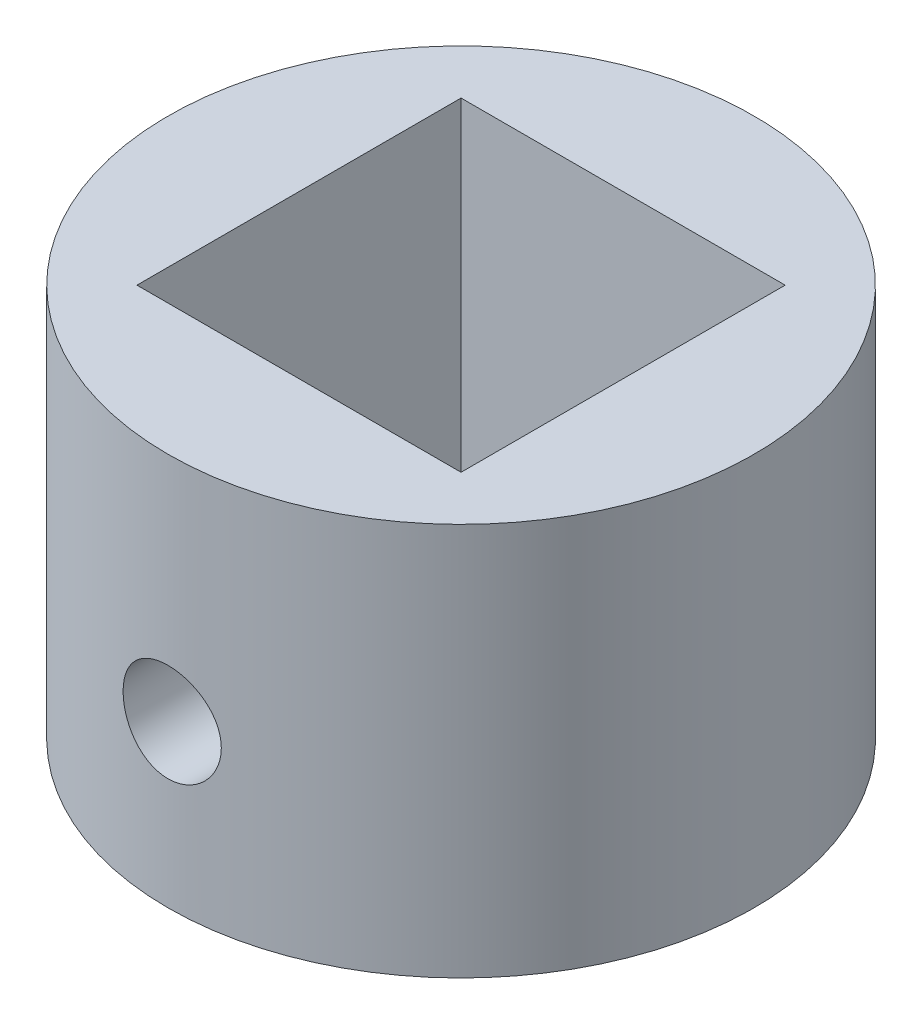
ISO-10303-21;
HEADER;
FILE_DESCRIPTION(('STEP AP214'),'2;1');
FILE_NAME('part.step','',(''),(''),'','','');
FILE_SCHEMA(('AUTOMOTIVE_DESIGN { 1 0 10303 214 1 1 1 1 }'));
ENDSEC;
DATA;
#1=APPLICATION_CONTEXT('core data for automotive mechanical design processes');
#2=APPLICATION_PROTOCOL_DEFINITION('international standard','automotive_design',2000,#1);
#3=PRODUCT_CONTEXT('',#1,'mechanical');
#4=PRODUCT('Part','Part','',(#3));
#5=PRODUCT_RELATED_PRODUCT_CATEGORY('part','',(#4));
#6=PRODUCT_DEFINITION_FORMATION('','',#4);
#7=PRODUCT_DEFINITION_CONTEXT('part definition',#1,'design');
#8=PRODUCT_DEFINITION('design','',#6,#7);
#9=PRODUCT_DEFINITION_SHAPE('','',#8);
#10=(LENGTH_UNIT() NAMED_UNIT(*) SI_UNIT(.MILLI.,.METRE.));
#11=(NAMED_UNIT(*) PLANE_ANGLE_UNIT() SI_UNIT($,.RADIAN.));
#12=(NAMED_UNIT(*) SI_UNIT($,.STERADIAN.) SOLID_ANGLE_UNIT());
#13=UNCERTAINTY_MEASURE_WITH_UNIT(LENGTH_MEASURE(1.E-05),#10,'distance_accuracy_value','');
#14=(GEOMETRIC_REPRESENTATION_CONTEXT(3) GLOBAL_UNCERTAINTY_ASSIGNED_CONTEXT((#13)) GLOBAL_UNIT_ASSIGNED_CONTEXT((#10,
#11,#12)) REPRESENTATION_CONTEXT('',''));
#15=CARTESIAN_POINT('',(0.,0.,0.));
#16=DIRECTION('',(0.,0.,1.));
#17=DIRECTION('',(1.,0.,0.));
#18=AXIS2_PLACEMENT_3D('',#15,#16,#17);
#19=CARTESIAN_POINT('',(0.,12.,0.));
#20=DIRECTION('',(0.,1.,0.));
#21=DIRECTION('',(0.,0.,1.));
#22=AXIS2_PLACEMENT_3D('',#19,#20,#21);
#23=PLANE('',#22);
#24=CARTESIAN_POINT('',(0.,12.,0.));
#25=DIRECTION('',(0.,1.,0.));
#26=DIRECTION('',(0.,0.,1.));
#27=AXIS2_PLACEMENT_3D('',#24,#25,#26);
#28=CIRCLE('',#27,8.95);
#29=CARTESIAN_POINT('',(0.,12.,8.95));
#30=VERTEX_POINT('',#29);
#31=EDGE_CURVE('E11',#30,#30,#28,.T.);
#32=ORIENTED_EDGE('',*,*,#31,.T.);
#33=EDGE_LOOP('',(#32));
#34=FACE_BOUND('',#33,.T.);
#35=DIRECTION('',(-1.,0.,0.));
#36=VECTOR('',#35,1.);
#37=CARTESIAN_POINT('',(-4.95,12.,-4.95));
#38=LINE('',#37,#36);
#39=CARTESIAN_POINT('',(4.95,12.,-4.95));
#40=VERTEX_POINT('',#39);
#41=CARTESIAN_POINT('',(-4.95,12.,-4.95));
#42=VERTEX_POINT('',#41);
#43=EDGE_CURVE('E94',#40,#42,#38,.T.);
#44=ORIENTED_EDGE('',*,*,#43,.F.);
#45=DIRECTION('',(0.,0.,-1.));
#46=VECTOR('',#45,1.);
#47=CARTESIAN_POINT('',(4.95,12.,4.95));
#48=LINE('',#47,#46);
#49=CARTESIAN_POINT('',(4.95,12.,4.95));
#50=VERTEX_POINT('',#49);
#51=EDGE_CURVE('E86',#50,#40,#48,.T.);
#52=ORIENTED_EDGE('',*,*,#51,.F.);
#53=DIRECTION('',(1.,0.,0.));
#54=VECTOR('',#53,1.);
#55=CARTESIAN_POINT('',(-4.95,12.,4.95));
#56=LINE('',#55,#54);
#57=CARTESIAN_POINT('',(-4.95,12.,4.95));
#58=VERTEX_POINT('',#57);
#59=EDGE_CURVE('E107',#58,#50,#56,.T.);
#60=ORIENTED_EDGE('',*,*,#59,.F.);
#61=DIRECTION('',(0.,0.,1.));
#62=VECTOR('',#61,1.);
#63=CARTESIAN_POINT('',(-4.95,12.,4.95));
#64=LINE('',#63,#62);
#65=EDGE_CURVE('E105',#42,#58,#64,.T.);
#66=ORIENTED_EDGE('',*,*,#65,.F.);
#67=EDGE_LOOP('',(#44,#52,#60,#66));
#68=FACE_BOUND('',#67,.T.);
#69=ADVANCED_FACE('F42',(#34,#68),#23,.T.);
#70=CARTESIAN_POINT('',(0.,0.,0.));
#71=DIRECTION('',(0.,1.,0.));
#72=DIRECTION('',(0.,0.,1.));
#73=AXIS2_PLACEMENT_3D('',#70,#71,#72);
#74=PLANE('',#73);
#75=CARTESIAN_POINT('',(0.,0.,0.));
#76=DIRECTION('',(0.,1.,0.));
#77=DIRECTION('',(0.,0.,1.));
#78=AXIS2_PLACEMENT_3D('',#75,#76,#77);
#79=CIRCLE('',#78,8.95);
#80=CARTESIAN_POINT('',(0.,0.,8.95));
#81=VERTEX_POINT('',#80);
#82=EDGE_CURVE('E52',#81,#81,#79,.T.);
#83=ORIENTED_EDGE('',*,*,#82,.F.);
#84=EDGE_LOOP('',(#83));
#85=FACE_BOUND('',#84,.T.);
#86=DIRECTION('',(0.,0.,-1.));
#87=VECTOR('',#86,1.);
#88=CARTESIAN_POINT('',(4.95,0.,4.95));
#89=LINE('',#88,#87);
#90=CARTESIAN_POINT('',(4.95,0.,4.95));
#91=VERTEX_POINT('',#90);
#92=CARTESIAN_POINT('',(4.95,0.,-4.95));
#93=VERTEX_POINT('',#92);
#94=EDGE_CURVE('E68',#91,#93,#89,.T.);
#95=ORIENTED_EDGE('',*,*,#94,.T.);
#96=DIRECTION('',(-1.,0.,0.));
#97=VECTOR('',#96,1.);
#98=CARTESIAN_POINT('',(-4.95,0.,-4.95));
#99=LINE('',#98,#97);
#100=CARTESIAN_POINT('',(-4.95,0.,-4.95));
#101=VERTEX_POINT('',#100);
#102=EDGE_CURVE('E101',#93,#101,#99,.T.);
#103=ORIENTED_EDGE('',*,*,#102,.T.);
#104=DIRECTION('',(0.,0.,1.));
#105=VECTOR('',#104,1.);
#106=CARTESIAN_POINT('',(-4.95,0.,4.95));
#107=LINE('',#106,#105);
#108=CARTESIAN_POINT('',(-4.95,0.,4.95));
#109=VERTEX_POINT('',#108);
#110=EDGE_CURVE('E115',#101,#109,#107,.T.);
#111=ORIENTED_EDGE('',*,*,#110,.T.);
#112=DIRECTION('',(1.,0.,0.));
#113=VECTOR('',#112,1.);
#114=CARTESIAN_POINT('',(-4.95,0.,4.95));
#115=LINE('',#114,#113);
#116=EDGE_CURVE('E95',#109,#91,#115,.T.);
#117=ORIENTED_EDGE('',*,*,#116,.T.);
#118=EDGE_LOOP('',(#95,#103,#111,#117));
#119=FACE_BOUND('',#118,.T.);
#120=ADVANCED_FACE('F126',(#85,#119),#74,.F.);
#121=CARTESIAN_POINT('',(0.,12.,0.));
#122=DIRECTION('',(0.,-1.,0.));
#123=DIRECTION('',(0.,0.,-1.));
#124=AXIS2_PLACEMENT_3D('',#121,#122,#123);
#125=CYLINDRICAL_SURFACE('',#124,8.95);
#126=CARTESIAN_POINT('',(0.,6.41640441757126,-8.95));
#127=CARTESIAN_POINT('',(-0.0836276578425225,6.41640107055489,-8.94999856261471));
#128=CARTESIAN_POINT('',(-0.167300784425094,6.40938720746998,-8.94881568632519));
#129=CARTESIAN_POINT('',(-0.332299797738771,6.38152900846727,-8.94421086846775));
#130=CARTESIAN_POINT('',(-0.413623462213301,6.36067199878909,-8.94078687513872));
#131=CARTESIAN_POINT('',(-0.571512522139868,6.30577532777072,-8.93208382582243));
#132=CARTESIAN_POINT('',(-0.648081767322954,6.27174649775223,-8.92680629434794));
#133=CARTESIAN_POINT('',(-0.794414175036057,6.19150060048699,-8.91497628068457));
#134=CARTESIAN_POINT('',(-0.864178105051243,6.14528490982375,-8.90842394251511));
#135=CARTESIAN_POINT('',(-0.995603292468503,6.04150218894269,-8.89469976077189));
#136=CARTESIAN_POINT('',(-1.05718925366115,5.98384044100901,-8.88752304938136));
#137=CARTESIAN_POINT('',(-1.16985985140307,5.85900627529462,-8.87339619174348));
#138=CARTESIAN_POINT('',(-1.22094382132366,5.79183325422921,-8.86644605990212));
#139=CARTESIAN_POINT('',(-1.31146257850313,5.64936548668228,-8.85351212297637));
#140=CARTESIAN_POINT('',(-1.35082281959017,5.57402275552588,-8.84753460692373));
#141=CARTESIAN_POINT('',(-1.4163000922383,5.41767813283281,-8.83729026639743));
#142=CARTESIAN_POINT('',(-1.44241802865548,5.3366766283946,-8.83302332504316));
#143=CARTESIAN_POINT('',(-1.48043188067477,5.17211225955366,-8.8267317233467));
#144=CARTESIAN_POINT('',(-1.49245784378552,5.0885802339558,-8.82468657227975));
#145=CARTESIAN_POINT('',(-1.50234960772392,4.92066082195292,-8.8230081312225));
#146=CARTESIAN_POINT('',(-1.50021642188284,4.83627349719089,-8.82337466863427));
#147=CARTESIAN_POINT('',(-1.48195634902036,4.66996786835801,-8.82645948472311));
#148=CARTESIAN_POINT('',(-1.46597562784436,4.58803299350396,-8.82915319831319));
#149=CARTESIAN_POINT('',(-1.42070353689134,4.4280241046137,-8.83655039399779));
#150=CARTESIAN_POINT('',(-1.39141170593019,4.34995022445159,-8.84125394572593));
#151=CARTESIAN_POINT('',(-1.32020091379681,4.19944240081394,-8.85216734487338));
#152=CARTESIAN_POINT('',(-1.27822132789776,4.12703768492842,-8.85838439572715));
#153=CARTESIAN_POINT('',(-1.18286970834621,3.99024472619314,-8.87161929616906));
#154=CARTESIAN_POINT('',(-1.12949674513407,3.92585713812161,-8.87863721107611));
#155=CARTESIAN_POINT('',(-1.01207740276801,3.80608015334662,-8.89279099567235));
#156=CARTESIAN_POINT('',(-0.947905631867502,3.75081365091105,-8.89992724130841));
#157=CARTESIAN_POINT('',(-0.811134167306982,3.65181432986657,-8.91343232356036));
#158=CARTESIAN_POINT('',(-0.738534418213784,3.60808158712464,-8.91980115512821));
#159=CARTESIAN_POINT('',(-0.58685175069757,3.53337972176388,-8.93106301150017));
#160=CARTESIAN_POINT('',(-0.507763345668922,3.50242153708126,-8.93595477063609));
#161=CARTESIAN_POINT('',(-0.345409327534189,3.45426205914378,-8.94370116542383));
#162=CARTESIAN_POINT('',(-0.262144068470421,3.43705960200031,-8.94655597342232));
#163=CARTESIAN_POINT('',(-0.0948590901710595,3.41706668084385,-8.94988360985503));
#164=CARTESIAN_POINT('',(-0.0108600676368816,3.41410752183697,-8.95038431815294));
#165=CARTESIAN_POINT('',(0.156433504629172,3.42223533244092,-8.94902372721207));
#166=CARTESIAN_POINT('',(0.239728081654211,3.43332175533422,-8.94716251990971));
#167=CARTESIAN_POINT('',(0.402726676669945,3.46908571924056,-8.94130449306362));
#168=CARTESIAN_POINT('',(0.482449549644626,3.49367966464659,-8.93732081360629));
#169=CARTESIAN_POINT('',(0.636640556830802,3.55567136882062,-8.92766273901769));
#170=CARTESIAN_POINT('',(0.711108392930595,3.59306985327105,-8.92198824806401));
#171=CARTESIAN_POINT('',(0.85340766591024,3.67999484377729,-8.90950888540787));
#172=CARTESIAN_POINT('',(0.921173930547693,3.72962662867277,-8.90269437569329));
#173=CARTESIAN_POINT('',(1.04747605096698,3.83946463344406,-8.88871976860809));
#174=CARTESIAN_POINT('',(1.10601122770284,3.89967163055271,-8.88155964586445));
#175=CARTESIAN_POINT('',(1.2128155547215,4.02970790341714,-8.86761055529433));
#176=CARTESIAN_POINT('',(1.26097067733854,4.09963141592652,-8.86082626405882));
#177=CARTESIAN_POINT('',(1.3448513557267,4.24667429710658,-8.84848460730731));
#178=CARTESIAN_POINT('',(1.38057730868976,4.32379343573083,-8.84292720258648));
#179=CARTESIAN_POINT('',(1.4384153552057,4.48272085480185,-8.83370370734321));
#180=CARTESIAN_POINT('',(1.46058401506153,4.56450807313577,-8.8300297687984));
#181=CARTESIAN_POINT('',(1.4908560483187,4.73071211581329,-8.82496956765171));
#182=CARTESIAN_POINT('',(1.49896065958406,4.81512870806359,-8.82358310371556));
#183=CARTESIAN_POINT('',(1.50083971978043,4.98305642624068,-8.82326357515345));
#184=CARTESIAN_POINT('',(1.49479366959576,5.06656553936276,-8.82429977885693));
#185=CARTESIAN_POINT('',(1.46893137727105,5.2313603203849,-8.82864144522924));
#186=CARTESIAN_POINT('',(1.44911518120995,5.31264599572427,-8.83194690030449));
#187=CARTESIAN_POINT('',(1.39634417098708,5.47061593280557,-8.84044289535412));
#188=CARTESIAN_POINT('',(1.36340498073701,5.54730554204743,-8.84563119301063));
#189=CARTESIAN_POINT('',(1.28534149510043,5.69409908566546,-8.85731043021037));
#190=CARTESIAN_POINT('',(1.24021658426074,5.76420268716696,-8.86380143554403));
#191=CARTESIAN_POINT('',(1.13842267366465,5.8967407910925,-8.87745205680301));
#192=CARTESIAN_POINT('',(1.08162167721475,5.95907320014712,-8.8846187596649));
#193=CARTESIAN_POINT('',(0.958366150310759,6.0733832576045,-8.8987568945774));
#194=CARTESIAN_POINT('',(0.89190939574773,6.12535851377993,-8.90572828119632));
#195=CARTESIAN_POINT('',(0.750676406403472,6.21781130165833,-8.91874680402516));
#196=CARTESIAN_POINT('',(0.675845256533438,6.25820590985455,-8.92478713785703));
#197=CARTESIAN_POINT('',(0.520388431034186,6.32578903067662,-8.93519676513686));
#198=CARTESIAN_POINT('',(0.439768604514946,6.35299066429397,-8.93956771793385));
#199=CARTESIAN_POINT('',(0.29903219622067,6.38752764645775,-8.94519490400263));
#200=CARTESIAN_POINT('',(0.239765841468602,6.39833904378052,-8.94698716059112));
#201=CARTESIAN_POINT('',(0.120340829948877,6.41277857072089,-8.94939021543986));
#202=CARTESIAN_POINT('',(0.0601821888384413,6.41640682623337,-8.9500010344065));
#203=CARTESIAN_POINT('',(0.,6.41640441757126,-8.95));
#204=B_SPLINE_CURVE_WITH_KNOTS('',3,(#126,#127,#128,#129,#130,#131,#132,#133,#134,#135,#136,
#137,#138,#139,#140,#141,#142,#143,#144,#145,#146,#147,#148,#149,#150,#151,#152,#153,#154,#155,
#156,#157,#158,#159,#160,#161,#162,#163,#164,#165,#166,#167,#168,#169,#170,#171,#172,#173,#174,
#175,#176,#177,#178,#179,#180,#181,#182,#183,#184,#185,#186,#187,#188,#189,#190,#191,#192,#193,
#194,#195,#196,#197,#198,#199,#200,#201,#202,#203),.UNSPECIFIED.,.T.,.F.,(4,2,2,2,2,2,2,2,2,2,2,
2,2,2,2,2,2,2,2,2,2,2,2,2,2,2,2,2,2,2,2,2,2,2,2,2,2,2,4),(0.,0.250662985605169,
0.501555776825953,0.75224269314888,1.00290130490935,1.25572779539878,1.50857032945399,
1.76298784707671,2.01738797782612,2.26942141588186,2.52143681679388,2.7708240653861,
3.02021995504672,3.27082687286626,3.52145424495241,3.77522287596301,4.028993176176,
4.28298031303878,4.53694595747045,4.78789615177877,5.03883657827154,5.28824119946884,
5.53765995772496,5.78930511021587,6.04096876529299,6.29527009123484,6.54956328986685,
6.80278810754753,7.05599063621295,7.30599873463377,7.55600599645807,7.80571649110001,
8.05543960000395,8.30815856536863,8.56093583461885,8.81548032501186,9.06977113797416,
9.25016255302532,9.43055080642953),.UNSPECIFIED.);
#205=CARTESIAN_POINT('',(0.,6.41640441757126,-8.95));
#206=VERTEX_POINT('',#205);
#207=EDGE_CURVE('E113',#206,#206,#204,.T.);
#208=ORIENTED_EDGE('',*,*,#207,.T.);
#209=EDGE_LOOP('',(#208));
#210=FACE_BOUND('',#209,.T.);
#211=CARTESIAN_POINT('',(1.5,4.91640441757126,8.82340637169115));
#212=CARTESIAN_POINT('',(1.49999664524797,4.83278605796687,8.82340788698588));
#213=CARTESIAN_POINT('',(1.49298428910813,4.74912220653196,8.82460791741294));
#214=CARTESIAN_POINT('',(1.46513261859001,4.58414245784526,8.82927393380717));
#215=CARTESIAN_POINT('',(1.44428059616823,4.50282879028873,8.83274200231965));
#216=CARTESIAN_POINT('',(1.38939850890438,4.34496088899433,8.84154052167307));
#217=CARTESIAN_POINT('',(1.35537951069243,4.26840272087834,8.84686940815972));
#218=CARTESIAN_POINT('',(1.27515678088054,4.12208894442803,8.85878728176095));
#219=CARTESIAN_POINT('',(1.22895440255991,4.05233258175541,8.865376128902));
#220=CARTESIAN_POINT('',(1.12518525239454,3.92089914307275,8.87914490052093));
#221=CARTESIAN_POINT('',(1.06752077843336,3.85929969153582,8.88632957351198));
#222=CARTESIAN_POINT('',(0.942675457788639,3.74660297316781,8.9004382918178));
#223=CARTESIAN_POINT('',(0.875494045010698,3.695506331517,8.90736232159776));
#224=CARTESIAN_POINT('',(0.733018633940118,3.60497408725105,8.92021987708746));
#225=CARTESIAN_POINT('',(0.657678094711189,3.56561076761782,8.92614716875855));
#226=CARTESIAN_POINT('',(0.501338224913997,3.50012720269206,8.93629054767225));
#227=CARTESIAN_POINT('',(0.420339266767652,3.47400608676591,8.94050674741019));
#228=CARTESIAN_POINT('',(0.255783887028254,3.43598593778737,8.94671936882264));
#229=CARTESIAN_POINT('',(0.172258384546146,3.42395646252802,8.94873613775046));
#230=CARTESIAN_POINT('',(0.00435183306258255,3.41405541269104,8.95039257935231));
#231=CARTESIAN_POINT('',(-0.0800291567665836,3.41618286548928,8.95003241532889));
#232=CARTESIAN_POINT('',(-0.246359434002987,3.43443362550989,8.94699167012579));
#233=CARTESIAN_POINT('',(-0.328324611609672,3.45041654836803,8.94433436446266));
#234=CARTESIAN_POINT('',(-0.488392959407515,3.49570345539073,8.93702387282671));
#235=CARTESIAN_POINT('',(-0.566496010863931,3.52500784882012,8.93237062553444));
#236=CARTESIAN_POINT('',(-0.717040106450305,3.59624512528913,8.92155149857901));
#237=CARTESIAN_POINT('',(-0.789453296803519,3.63823578113059,8.91537872337415));
#238=CARTESIAN_POINT('',(-0.926258558260345,3.73361128458291,8.90220620931954));
#239=CARTESIAN_POINT('',(-0.990649972393864,3.78699706446518,8.89520640282867));
#240=CARTESIAN_POINT('',(-1.11041337028744,3.90442580358771,8.88105680266767));
#241=CARTESIAN_POINT('',(-1.16566501904935,3.96859146458363,8.87390622243907));
#242=CARTESIAN_POINT('',(-1.26463723899668,4.10534530740685,8.86034399964802));
#243=CARTESIAN_POINT('',(-1.30835770149262,4.17793356861376,8.85393236405097));
#244=CARTESIAN_POINT('',(-1.38305059620524,4.32961250674497,8.84257354512198));
#245=CARTESIAN_POINT('',(-1.41400841231667,4.40871051517335,8.8376280426526));
#246=CARTESIAN_POINT('',(-1.46216423960712,4.57108549674336,8.82978916785699));
#247=CARTESIAN_POINT('',(-1.47936347678148,4.65436209683738,8.82689561268907));
#248=CARTESIAN_POINT('',(-1.49934421065081,4.82165330973747,8.82352365975411));
#249=CARTESIAN_POINT('',(-1.50229730331633,4.90564686697815,8.82301651926695));
#250=CARTESIAN_POINT('',(-1.49415931107094,5.07292807578816,8.82439824257821));
#251=CARTESIAN_POINT('',(-1.48306877495401,5.15621575481362,8.82628701274973));
#252=CARTESIAN_POINT('',(-1.44730469047293,5.31917508083171,8.83222117529859));
#253=CARTESIAN_POINT('',(-1.42271859736662,5.39886647191538,8.83625267685319));
#254=CARTESIAN_POINT('',(-1.36075307573432,5.5529979673751,8.84600638281222));
#255=CARTESIAN_POINT('',(-1.32337287418044,5.62743775411813,8.85172868937327));
#256=CARTESIAN_POINT('',(-1.23647565773692,5.76971634134532,8.86428597322699));
#257=CARTESIAN_POINT('',(-1.18684874594955,5.83748713455531,8.87113082608415));
#258=CARTESIAN_POINT('',(-1.07701756011209,5.96380064342907,8.88513312077976));
#259=CARTESIAN_POINT('',(-1.01681253342989,6.02234270190636,8.89229058483322));
#260=CARTESIAN_POINT('',(-0.886773610914888,6.12916416185291,8.90620261220251));
#261=CARTESIAN_POINT('',(-0.816845056399829,6.17732908570405,8.91295214316917));
#262=CARTESIAN_POINT('',(-0.669789259703509,6.26122693791163,8.92520691018798));
#263=CARTESIAN_POINT('',(-0.592662252491373,6.29696027187538,8.93071218683453));
#264=CARTESIAN_POINT('',(-0.433737981233232,6.35480274986487,8.93983628639291));
#265=CARTESIAN_POINT('',(-0.351962958286291,6.37697164286007,8.94346337138285));
#266=CARTESIAN_POINT('',(-0.185784818959008,6.40724826637674,8.94845735640256));
#267=CARTESIAN_POINT('',(-0.101381921947105,6.41535716740505,8.94982444457863));
#268=CARTESIAN_POINT('',(0.0665514556773504,6.41724964248712,8.95014169694586));
#269=CARTESIAN_POINT('',(0.150079969689913,6.41120734294444,8.94912123934745));
#270=CARTESIAN_POINT('',(0.314914536503222,6.38534576409686,8.94483807963715));
#271=CARTESIAN_POINT('',(0.39622060208754,6.36552656405433,8.94157539042546));
#272=CARTESIAN_POINT('',(0.554234712090467,6.3127408813724,8.93317313063047));
#273=CARTESIAN_POINT('',(0.630947876132932,6.27978936320064,8.92803569690596));
#274=CARTESIAN_POINT('',(0.777783449775942,6.20169386708852,8.91644457163951));
#275=CARTESIAN_POINT('',(0.847905541078203,6.15654930072479,8.90999081657701));
#276=CARTESIAN_POINT('',(0.980445214626264,6.05473266664611,8.8963882162547));
#277=CARTESIAN_POINT('',(1.04276417248325,5.99793316075782,8.88923218709712));
#278=CARTESIAN_POINT('',(1.15704778247379,5.87468629376898,8.87508112266019));
#279=CARTESIAN_POINT('',(1.2090100059031,5.8082366759711,8.86808612548298));
#280=CARTESIAN_POINT('',(1.30144742961715,5.66701054493403,8.85499497438109));
#281=CARTESIAN_POINT('',(1.34183769401192,5.59217780267087,8.84890561681305));
#282=CARTESIAN_POINT('',(1.40941226375372,5.43671785699961,8.83839558221815));
#283=CARTESIAN_POINT('',(1.43660973130434,5.35609652136136,8.83397324302481));
#284=CARTESIAN_POINT('',(1.47113597718491,5.21537101090951,8.82827624842481));
#285=CARTESIAN_POINT('',(1.48194256994382,5.15611779316736,8.82646022810219));
#286=CARTESIAN_POINT('',(1.49637572195086,5.03671903001427,8.8240247556201));
#287=CARTESIAN_POINT('',(1.50000241397172,4.97657350112492,8.82340528133377));
#288=CARTESIAN_POINT('',(1.5,4.91640441757126,8.82340637169115));
#289=B_SPLINE_CURVE_WITH_KNOTS('',3,(#211,#212,#213,#214,#215,#216,#217,#218,#219,#220,#221,
#222,#223,#224,#225,#226,#227,#228,#229,#230,#231,#232,#233,#234,#235,#236,#237,#238,#239,#240,
#241,#242,#243,#244,#245,#246,#247,#248,#249,#250,#251,#252,#253,#254,#255,#256,#257,#258,#259,
#260,#261,#262,#263,#264,#265,#266,#267,#268,#269,#270,#271,#272,#273,#274,#275,#276,#277,#278,
#279,#280,#281,#282,#283,#284,#285,#286,#287,#288),.UNSPECIFIED.,.T.,.F.,(4,2,2,2,2,2,2,2,2,2,2,
2,2,2,2,2,2,2,2,2,2,2,2,2,2,2,2,2,2,2,2,2,2,2,2,2,2,2,4),(0.,0.250635044317572,
0.501500549086031,0.752155661722234,1.00278294434798,1.25564600978313,1.50852412254839,
1.7629293352835,2.0173178194987,2.26933241485467,2.5213296962182,2.77080317996525,
3.02028432860362,3.27091918374377,3.52157455198503,3.77530480591395,4.02903745134211,
4.28305987596178,4.53705966270511,4.78799222969945,5.03891499110594,5.28823057237177,
5.53756122009797,5.78921625565521,6.04088920370604,6.29521053048567,6.54952355870768,
6.80270816333509,7.05587168910651,7.30593650662898,7.55599988547038,7.80577912449145,
8.05557041974414,8.30825437997113,8.56099752626848,8.81555082863448,9.06984964296357,
9.25020189903017,9.43055081994139),.UNSPECIFIED.);
#290=CARTESIAN_POINT('',(1.5,4.91640441757126,8.82340637169115));
#291=VERTEX_POINT('',#290);
#292=EDGE_CURVE('E163',#291,#291,#289,.T.);
#293=ORIENTED_EDGE('',*,*,#292,.T.);
#294=EDGE_LOOP('',(#293));
#295=FACE_BOUND('',#294,.T.);
#296=ORIENTED_EDGE('',*,*,#31,.F.);
#297=EDGE_LOOP('',(#296));
#298=FACE_BOUND('',#297,.T.);
#299=ORIENTED_EDGE('',*,*,#82,.T.);
#300=EDGE_LOOP('',(#299));
#301=FACE_BOUND('',#300,.T.);
#302=ADVANCED_FACE('F44',(#210,#295,#298,#301),#125,.T.);
#303=CARTESIAN_POINT('',(4.95,12.,4.95));
#304=DIRECTION('',(-1.,0.,0.));
#305=DIRECTION('',(0.,0.,1.));
#306=AXIS2_PLACEMENT_3D('',#303,#304,#305);
#307=PLANE('',#306);
#308=ORIENTED_EDGE('',*,*,#94,.F.);
#309=DIRECTION('',(0.,-1.,0.));
#310=VECTOR('',#309,1.);
#311=CARTESIAN_POINT('',(4.95,12.,4.95));
#312=LINE('',#311,#310);
#313=EDGE_CURVE('E90',#50,#91,#312,.T.);
#314=ORIENTED_EDGE('',*,*,#313,.F.);
#315=ORIENTED_EDGE('',*,*,#51,.T.);
#316=DIRECTION('',(0.,-1.,0.));
#317=VECTOR('',#316,1.);
#318=CARTESIAN_POINT('',(4.95,12.,-4.95));
#319=LINE('',#318,#317);
#320=EDGE_CURVE('E89',#40,#93,#319,.T.);
#321=ORIENTED_EDGE('',*,*,#320,.T.);
#322=EDGE_LOOP('',(#308,#314,#315,#321));
#323=FACE_BOUND('',#322,.T.);
#324=ADVANCED_FACE('F88',(#323),#307,.T.);
#325=CARTESIAN_POINT('',(-4.95,12.,-4.95));
#326=DIRECTION('',(0.,0.,1.));
#327=DIRECTION('',(1.,0.,0.));
#328=AXIS2_PLACEMENT_3D('',#325,#326,#327);
#329=PLANE('',#328);
#330=CARTESIAN_POINT('',(0.,4.91640441757126,-4.95));
#331=DIRECTION('',(0.,0.,1.));
#332=DIRECTION('',(1.,0.,0.));
#333=AXIS2_PLACEMENT_3D('',#330,#331,#332);
#334=CIRCLE('',#333,1.5);
#335=CARTESIAN_POINT('',(1.5,4.91640441757126,-4.95));
#336=VERTEX_POINT('',#335);
#337=EDGE_CURVE('E161',#336,#336,#334,.T.);
#338=ORIENTED_EDGE('',*,*,#337,.F.);
#339=EDGE_LOOP('',(#338));
#340=FACE_BOUND('',#339,.T.);
#341=ORIENTED_EDGE('',*,*,#102,.F.);
#342=ORIENTED_EDGE('',*,*,#320,.F.);
#343=ORIENTED_EDGE('',*,*,#43,.T.);
#344=DIRECTION('',(0.,-1.,0.));
#345=VECTOR('',#344,1.);
#346=CARTESIAN_POINT('',(-4.95,12.,-4.95));
#347=LINE('',#346,#345);
#348=EDGE_CURVE('E102',#42,#101,#347,.T.);
#349=ORIENTED_EDGE('',*,*,#348,.T.);
#350=EDGE_LOOP('',(#341,#342,#343,#349));
#351=FACE_BOUND('',#350,.T.);
#352=ADVANCED_FACE('F98',(#340,#351),#329,.T.);
#353=CARTESIAN_POINT('',(-4.95,12.,4.95));
#354=DIRECTION('',(1.,0.,0.));
#355=DIRECTION('',(0.,0.,-1.));
#356=AXIS2_PLACEMENT_3D('',#353,#354,#355);
#357=PLANE('',#356);
#358=ORIENTED_EDGE('',*,*,#110,.F.);
#359=ORIENTED_EDGE('',*,*,#348,.F.);
#360=ORIENTED_EDGE('',*,*,#65,.T.);
#361=DIRECTION('',(0.,-1.,0.));
#362=VECTOR('',#361,1.);
#363=CARTESIAN_POINT('',(-4.95,12.,4.95));
#364=LINE('',#363,#362);
#365=EDGE_CURVE('E60',#58,#109,#364,.T.);
#366=ORIENTED_EDGE('',*,*,#365,.T.);
#367=EDGE_LOOP('',(#358,#359,#360,#366));
#368=FACE_BOUND('',#367,.T.);
#369=ADVANCED_FACE('F133',(#368),#357,.T.);
#370=CARTESIAN_POINT('',(-4.95,12.,4.95));
#371=DIRECTION('',(0.,0.,-1.));
#372=DIRECTION('',(-1.,0.,0.));
#373=AXIS2_PLACEMENT_3D('',#370,#371,#372);
#374=PLANE('',#373);
#375=CARTESIAN_POINT('',(0.,4.91640441757126,4.95));
#376=DIRECTION('',(0.,0.,-1.));
#377=DIRECTION('',(-1.,0.,0.));
#378=AXIS2_PLACEMENT_3D('',#375,#376,#377);
#379=CIRCLE('',#378,1.5);
#380=CARTESIAN_POINT('',(-1.5,4.91640441757126,4.95));
#381=VERTEX_POINT('',#380);
#382=EDGE_CURVE('E47',#381,#381,#379,.T.);
#383=ORIENTED_EDGE('',*,*,#382,.F.);
#384=EDGE_LOOP('',(#383));
#385=FACE_BOUND('',#384,.T.);
#386=ORIENTED_EDGE('',*,*,#116,.F.);
#387=ORIENTED_EDGE('',*,*,#365,.F.);
#388=ORIENTED_EDGE('',*,*,#59,.T.);
#389=ORIENTED_EDGE('',*,*,#313,.T.);
#390=EDGE_LOOP('',(#386,#387,#388,#389));
#391=FACE_BOUND('',#390,.T.);
#392=ADVANCED_FACE('F130',(#385,#391),#374,.T.);
#393=CARTESIAN_POINT('',(0.,4.91640441757126,-8.95));
#394=DIRECTION('',(0.,0.,1.));
#395=DIRECTION('',(1.,0.,0.));
#396=AXIS2_PLACEMENT_3D('',#393,#394,#395);
#397=CYLINDRICAL_SURFACE('',#396,1.5);
#398=ORIENTED_EDGE('',*,*,#382,.T.);
#399=EDGE_LOOP('',(#398));
#400=FACE_BOUND('',#399,.T.);
#401=ORIENTED_EDGE('',*,*,#292,.F.);
#402=EDGE_LOOP('',(#401));
#403=FACE_BOUND('',#402,.T.);
#404=ADVANCED_FACE('F132',(#400,#403),#397,.F.);
#405=ORIENTED_EDGE('',*,*,#337,.T.);
#406=EDGE_LOOP('',(#405));
#407=FACE_BOUND('',#406,.T.);
#408=ORIENTED_EDGE('',*,*,#207,.F.);
#409=EDGE_LOOP('',(#408));
#410=FACE_BOUND('',#409,.T.);
#411=ADVANCED_FACE('F140',(#407,#410),#397,.F.);
#412=CLOSED_SHELL('',(#69,#120,#302,#324,#352,#369,#392,#404,#411));
#413=MANIFOLD_SOLID_BREP('B2',#412);
#414=ADVANCED_BREP_SHAPE_REPRESENTATION('',(#18,#413),#14);
#415=SHAPE_DEFINITION_REPRESENTATION(#9,#414);
ENDSEC;
END-ISO-10303-21;
